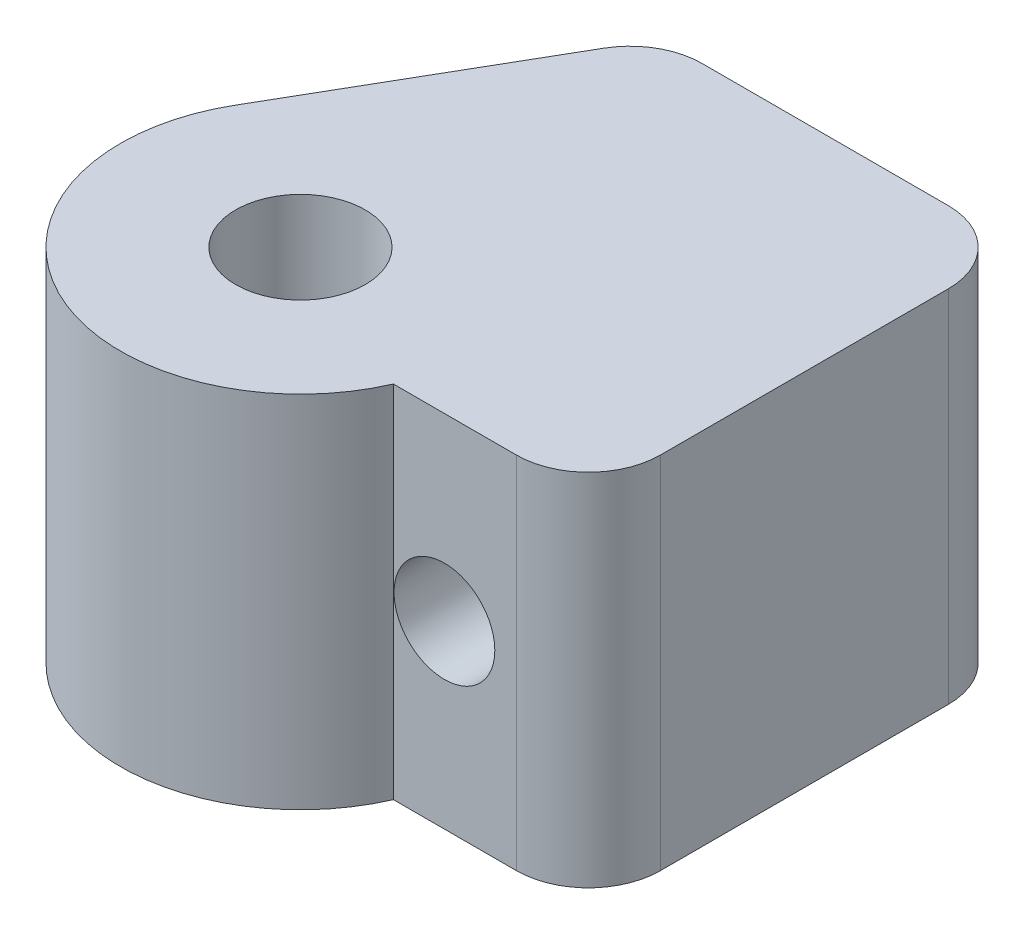
ISO-10303-21;
HEADER;
FILE_DESCRIPTION(('STEP AP214'),'2;1');
FILE_NAME('part.step','',(''),(''),'','','');
FILE_SCHEMA(('AUTOMOTIVE_DESIGN { 1 0 10303 214 1 1 1 1 }'));
ENDSEC;
DATA;
#1=APPLICATION_CONTEXT('core data for automotive mechanical design processes');
#2=APPLICATION_PROTOCOL_DEFINITION('international standard','automotive_design',2000,#1);
#3=PRODUCT_CONTEXT('',#1,'mechanical');
#4=PRODUCT('Part','Part','',(#3));
#5=PRODUCT_RELATED_PRODUCT_CATEGORY('part','',(#4));
#6=PRODUCT_DEFINITION_FORMATION('','',#4);
#7=PRODUCT_DEFINITION_CONTEXT('part definition',#1,'design');
#8=PRODUCT_DEFINITION('design','',#6,#7);
#9=PRODUCT_DEFINITION_SHAPE('','',#8);
#10=(LENGTH_UNIT() NAMED_UNIT(*) SI_UNIT(.MILLI.,.METRE.));
#11=(NAMED_UNIT(*) PLANE_ANGLE_UNIT() SI_UNIT($,.RADIAN.));
#12=(NAMED_UNIT(*) SI_UNIT($,.STERADIAN.) SOLID_ANGLE_UNIT());
#13=UNCERTAINTY_MEASURE_WITH_UNIT(LENGTH_MEASURE(1.E-05),#10,'distance_accuracy_value','');
#14=(GEOMETRIC_REPRESENTATION_CONTEXT(3) GLOBAL_UNCERTAINTY_ASSIGNED_CONTEXT((#13)) GLOBAL_UNIT_ASSIGNED_CONTEXT((#10,
#11,#12)) REPRESENTATION_CONTEXT('',''));
#15=CARTESIAN_POINT('',(0.,0.,0.));
#16=DIRECTION('',(0.,0.,1.));
#17=DIRECTION('',(1.,0.,0.));
#18=AXIS2_PLACEMENT_3D('',#15,#16,#17);
#19=CARTESIAN_POINT('',(0.,12.7,0.));
#20=DIRECTION('',(0.,1.,0.));
#21=DIRECTION('',(0.,0.,1.));
#22=AXIS2_PLACEMENT_3D('',#19,#20,#21);
#23=PLANE('',#22);
#24=DIRECTION('',(1.,0.,0.));
#25=VECTOR('',#24,1.);
#26=CARTESIAN_POINT('',(0.,12.7,-12.7));
#27=LINE('',#26,#25);
#28=CARTESIAN_POINT('',(1.46646968374165,12.7,-12.7));
#29=VERTEX_POINT('',#28);
#30=CARTESIAN_POINT('',(10.16,12.7,-12.7));
#31=VERTEX_POINT('',#30);
#32=EDGE_CURVE('E154',#29,#31,#27,.T.);
#33=ORIENTED_EDGE('',*,*,#32,.F.);
#34=CARTESIAN_POINT('',(1.46646968374165,12.7,-10.16));
#35=DIRECTION('',(0.,1.,0.));
#36=DIRECTION('',(0.,0.,1.));
#37=AXIS2_PLACEMENT_3D('',#34,#35,#36);
#38=CIRCLE('',#37,2.54);
#39=CARTESIAN_POINT('',(-0.733234841870825,12.7,-11.43));
#40=VERTEX_POINT('',#39);
#41=EDGE_CURVE('E152',#29,#40,#38,.T.);
#42=ORIENTED_EDGE('',*,*,#41,.T.);
#43=DIRECTION('',(0.5,0.,-0.866025403784439));
#44=VECTOR('',#43,1.);
#45=CARTESIAN_POINT('',(-5.49926131403118,12.7,-3.175));
#46=LINE('',#45,#44);
#47=CARTESIAN_POINT('',(-5.49926131403118,12.7,-3.175));
#48=VERTEX_POINT('',#47);
#49=EDGE_CURVE('E132',#48,#40,#46,.T.);
#50=ORIENTED_EDGE('',*,*,#49,.F.);
#51=CARTESIAN_POINT('',(0.,12.7,0.));
#52=DIRECTION('',(0.,1.,0.));
#53=DIRECTION('',(0.,0.,1.));
#54=AXIS2_PLACEMENT_3D('',#51,#52,#53);
#55=CIRCLE('',#54,6.35);
#56=CARTESIAN_POINT('',(5.81987113259392,12.7,2.54));
#57=VERTEX_POINT('',#56);
#58=EDGE_CURVE('E143',#48,#57,#55,.T.);
#59=ORIENTED_EDGE('',*,*,#58,.T.);
#60=DIRECTION('',(1.,0.,0.));
#61=VECTOR('',#60,1.);
#62=CARTESIAN_POINT('',(5.81987113259392,12.7,2.54));
#63=LINE('',#62,#61);
#64=CARTESIAN_POINT('',(10.16,12.7,2.54));
#65=VERTEX_POINT('',#64);
#66=EDGE_CURVE('E179',#57,#65,#63,.T.);
#67=ORIENTED_EDGE('',*,*,#66,.T.);
#68=CARTESIAN_POINT('',(10.16,12.7,0.));
#69=DIRECTION('',(0.,1.,0.));
#70=DIRECTION('',(0.,0.,1.));
#71=AXIS2_PLACEMENT_3D('',#68,#69,#70);
#72=CIRCLE('',#71,2.54);
#73=CARTESIAN_POINT('',(12.7,12.7,0.));
#74=VERTEX_POINT('',#73);
#75=EDGE_CURVE('E83',#65,#74,#72,.T.);
#76=ORIENTED_EDGE('',*,*,#75,.T.);
#77=DIRECTION('',(0.,0.,-1.));
#78=VECTOR('',#77,1.);
#79=CARTESIAN_POINT('',(12.7,12.7,2.54));
#80=LINE('',#79,#78);
#81=CARTESIAN_POINT('',(12.7,12.7,-10.16));
#82=VERTEX_POINT('',#81);
#83=EDGE_CURVE('E158',#74,#82,#80,.T.);
#84=ORIENTED_EDGE('',*,*,#83,.T.);
#85=CARTESIAN_POINT('',(10.16,12.7,-10.16));
#86=DIRECTION('',(0.,1.,0.));
#87=DIRECTION('',(0.,0.,1.));
#88=AXIS2_PLACEMENT_3D('',#85,#86,#87);
#89=CIRCLE('',#88,2.54);
#90=EDGE_CURVE('E202',#82,#31,#89,.T.);
#91=ORIENTED_EDGE('',*,*,#90,.T.);
#92=EDGE_LOOP('',(#33,#42,#50,#59,#67,#76,#84,#91));
#93=FACE_BOUND('',#92,.T.);
#94=CARTESIAN_POINT('',(0.,12.7,0.));
#95=DIRECTION('',(0.,1.,0.));
#96=DIRECTION('',(0.,0.,1.));
#97=AXIS2_PLACEMENT_3D('',#94,#95,#96);
#98=CIRCLE('',#97,2.286);
#99=CARTESIAN_POINT('',(0.,12.7,2.286));
#100=VERTEX_POINT('',#99);
#101=EDGE_CURVE('E167',#100,#100,#98,.T.);
#102=ORIENTED_EDGE('',*,*,#101,.F.);
#103=EDGE_LOOP('',(#102));
#104=FACE_BOUND('',#103,.T.);
#105=ADVANCED_FACE('F61',(#93,#104),#23,.T.);
#106=CARTESIAN_POINT('',(0.,0.,0.));
#107=DIRECTION('',(0.,1.,0.));
#108=DIRECTION('',(0.,0.,1.));
#109=AXIS2_PLACEMENT_3D('',#106,#107,#108);
#110=PLANE('',#109);
#111=DIRECTION('',(0.5,0.,-0.866025403784439));
#112=VECTOR('',#111,1.);
#113=CARTESIAN_POINT('',(-5.49926131403118,0.,-3.175));
#114=LINE('',#113,#112);
#115=CARTESIAN_POINT('',(-5.49926131403118,0.,-3.175));
#116=VERTEX_POINT('',#115);
#117=CARTESIAN_POINT('',(-0.733234841870825,0.,-11.43));
#118=VERTEX_POINT('',#117);
#119=EDGE_CURVE('E135',#116,#118,#114,.T.);
#120=ORIENTED_EDGE('',*,*,#119,.T.);
#121=CARTESIAN_POINT('',(1.46646968374165,0.,-10.16));
#122=DIRECTION('',(0.,1.,0.));
#123=DIRECTION('',(0.,0.,1.));
#124=AXIS2_PLACEMENT_3D('',#121,#122,#123);
#125=CIRCLE('',#124,2.54);
#126=CARTESIAN_POINT('',(1.46646968374165,0.,-12.7));
#127=VERTEX_POINT('',#126);
#128=EDGE_CURVE('E190',#118,#127,#125,.F.);
#129=ORIENTED_EDGE('',*,*,#128,.T.);
#130=DIRECTION('',(1.,0.,0.));
#131=VECTOR('',#130,1.);
#132=CARTESIAN_POINT('',(0.,0.,-12.7));
#133=LINE('',#132,#131);
#134=CARTESIAN_POINT('',(10.16,0.,-12.7));
#135=VERTEX_POINT('',#134);
#136=EDGE_CURVE('E170',#127,#135,#133,.T.);
#137=ORIENTED_EDGE('',*,*,#136,.T.);
#138=CARTESIAN_POINT('',(10.16,0.,-10.16));
#139=DIRECTION('',(0.,1.,0.));
#140=DIRECTION('',(0.,0.,1.));
#141=AXIS2_PLACEMENT_3D('',#138,#139,#140);
#142=CIRCLE('',#141,2.54);
#143=CARTESIAN_POINT('',(12.7,0.,-10.16));
#144=VERTEX_POINT('',#143);
#145=EDGE_CURVE('E187',#135,#144,#142,.F.);
#146=ORIENTED_EDGE('',*,*,#145,.T.);
#147=DIRECTION('',(0.,0.,-1.));
#148=VECTOR('',#147,1.);
#149=CARTESIAN_POINT('',(12.7,0.,2.54));
#150=LINE('',#149,#148);
#151=CARTESIAN_POINT('',(12.7,0.,0.));
#152=VERTEX_POINT('',#151);
#153=EDGE_CURVE('E166',#152,#144,#150,.T.);
#154=ORIENTED_EDGE('',*,*,#153,.F.);
#155=CARTESIAN_POINT('',(10.16,0.,0.));
#156=DIRECTION('',(0.,1.,0.));
#157=DIRECTION('',(0.,0.,1.));
#158=AXIS2_PLACEMENT_3D('',#155,#156,#157);
#159=CIRCLE('',#158,2.54);
#160=CARTESIAN_POINT('',(10.16,0.,2.54));
#161=VERTEX_POINT('',#160);
#162=EDGE_CURVE('E184',#152,#161,#159,.F.);
#163=ORIENTED_EDGE('',*,*,#162,.T.);
#164=DIRECTION('',(1.,0.,0.));
#165=VECTOR('',#164,1.);
#166=CARTESIAN_POINT('',(5.81987113259392,0.,2.54));
#167=LINE('',#166,#165);
#168=CARTESIAN_POINT('',(5.81987113259392,0.,2.54));
#169=VERTEX_POINT('',#168);
#170=EDGE_CURVE('E162',#169,#161,#167,.T.);
#171=ORIENTED_EDGE('',*,*,#170,.F.);
#172=CARTESIAN_POINT('',(0.,0.,0.));
#173=DIRECTION('',(0.,1.,0.));
#174=DIRECTION('',(0.,0.,1.));
#175=AXIS2_PLACEMENT_3D('',#172,#173,#174);
#176=CIRCLE('',#175,6.35);
#177=EDGE_CURVE('E176',#116,#169,#176,.T.);
#178=ORIENTED_EDGE('',*,*,#177,.F.);
#179=EDGE_LOOP('',(#120,#129,#137,#146,#154,#163,#171,#178));
#180=FACE_BOUND('',#179,.T.);
#181=CARTESIAN_POINT('',(0.,0.,0.));
#182=DIRECTION('',(0.,1.,0.));
#183=DIRECTION('',(0.,0.,1.));
#184=AXIS2_PLACEMENT_3D('',#181,#182,#183);
#185=CIRCLE('',#184,2.286);
#186=CARTESIAN_POINT('',(0.,0.,2.286));
#187=VERTEX_POINT('',#186);
#188=EDGE_CURVE('E236',#187,#187,#185,.T.);
#189=ORIENTED_EDGE('',*,*,#188,.T.);
#190=EDGE_LOOP('',(#189));
#191=FACE_BOUND('',#190,.T.);
#192=ADVANCED_FACE('F216',(#180,#191),#110,.F.);
#193=CARTESIAN_POINT('',(5.81987113259392,12.7,2.54));
#194=DIRECTION('',(0.,0.,-1.));
#195=DIRECTION('',(-1.,0.,0.));
#196=AXIS2_PLACEMENT_3D('',#193,#194,#195);
#197=PLANE('',#196);
#198=CARTESIAN_POINT('',(7.62,6.35,2.54));
#199=DIRECTION('',(0.,0.,1.));
#200=DIRECTION('',(1.,0.,0.));
#201=AXIS2_PLACEMENT_3D('',#198,#199,#200);
#202=CIRCLE('',#201,1.778);
#203=CARTESIAN_POINT('',(9.398,6.35,2.54));
#204=VERTEX_POINT('',#203);
#205=EDGE_CURVE('E244',#204,#204,#202,.T.);
#206=ORIENTED_EDGE('',*,*,#205,.F.);
#207=EDGE_LOOP('',(#206));
#208=FACE_BOUND('',#207,.T.);
#209=ORIENTED_EDGE('',*,*,#170,.T.);
#210=DIRECTION('',(0.,-1.,0.));
#211=VECTOR('',#210,1.);
#212=CARTESIAN_POINT('',(10.16,12.7,2.54));
#213=LINE('',#212,#211);
#214=EDGE_CURVE('E12',#161,#65,#213,.F.);
#215=ORIENTED_EDGE('',*,*,#214,.T.);
#216=ORIENTED_EDGE('',*,*,#66,.F.);
#217=DIRECTION('',(0.,-1.,0.));
#218=VECTOR('',#217,1.);
#219=CARTESIAN_POINT('',(5.81987113259392,12.7,2.54));
#220=LINE('',#219,#218);
#221=EDGE_CURVE('E140',#57,#169,#220,.T.);
#222=ORIENTED_EDGE('',*,*,#221,.T.);
#223=EDGE_LOOP('',(#209,#215,#216,#222));
#224=FACE_BOUND('',#223,.T.);
#225=ADVANCED_FACE('F230',(#208,#224),#197,.F.);
#226=CARTESIAN_POINT('',(12.7,12.7,2.54));
#227=DIRECTION('',(-1.,0.,0.));
#228=DIRECTION('',(0.,0.,1.));
#229=AXIS2_PLACEMENT_3D('',#226,#227,#228);
#230=PLANE('',#229);
#231=ORIENTED_EDGE('',*,*,#153,.T.);
#232=DIRECTION('',(0.,-1.,0.));
#233=VECTOR('',#232,1.);
#234=CARTESIAN_POINT('',(12.7,12.7,-10.16));
#235=LINE('',#234,#233);
#236=EDGE_CURVE('E70',#144,#82,#235,.F.);
#237=ORIENTED_EDGE('',*,*,#236,.T.);
#238=ORIENTED_EDGE('',*,*,#83,.F.);
#239=DIRECTION('',(0.,-1.,0.));
#240=VECTOR('',#239,1.);
#241=CARTESIAN_POINT('',(12.7,12.7,0.));
#242=LINE('',#241,#240);
#243=EDGE_CURVE('E207',#74,#152,#242,.T.);
#244=ORIENTED_EDGE('',*,*,#243,.T.);
#245=EDGE_LOOP('',(#231,#237,#238,#244));
#246=FACE_BOUND('',#245,.T.);
#247=ADVANCED_FACE('F213',(#246),#230,.F.);
#248=CARTESIAN_POINT('',(0.,12.7,-12.7));
#249=DIRECTION('',(0.,0.,-1.));
#250=DIRECTION('',(-1.,0.,0.));
#251=AXIS2_PLACEMENT_3D('',#248,#249,#250);
#252=PLANE('',#251);
#253=CARTESIAN_POINT('',(7.62,6.35,-12.7));
#254=DIRECTION('',(0.,0.,1.));
#255=DIRECTION('',(1.,0.,0.));
#256=AXIS2_PLACEMENT_3D('',#253,#254,#255);
#257=CIRCLE('',#256,1.778);
#258=CARTESIAN_POINT('',(9.398,6.35,-12.7));
#259=VERTEX_POINT('',#258);
#260=EDGE_CURVE('E240',#259,#259,#257,.T.);
#261=ORIENTED_EDGE('',*,*,#260,.T.);
#262=EDGE_LOOP('',(#261));
#263=FACE_BOUND('',#262,.T.);
#264=ORIENTED_EDGE('',*,*,#136,.F.);
#265=DIRECTION('',(0.,-1.,0.));
#266=VECTOR('',#265,1.);
#267=CARTESIAN_POINT('',(1.46646968374165,12.7,-12.7));
#268=LINE('',#267,#266);
#269=EDGE_CURVE('E197',#127,#29,#268,.F.);
#270=ORIENTED_EDGE('',*,*,#269,.T.);
#271=ORIENTED_EDGE('',*,*,#32,.T.);
#272=DIRECTION('',(0.,-1.,0.));
#273=VECTOR('',#272,1.);
#274=CARTESIAN_POINT('',(10.16,0.,-12.7));
#275=LINE('',#274,#273);
#276=EDGE_CURVE('E193',#31,#135,#275,.T.);
#277=ORIENTED_EDGE('',*,*,#276,.T.);
#278=EDGE_LOOP('',(#264,#270,#271,#277));
#279=FACE_BOUND('',#278,.T.);
#280=ADVANCED_FACE('F225',(#263,#279),#252,.T.);
#281=CARTESIAN_POINT('',(-5.49926131403118,12.7,-3.175));
#282=DIRECTION('',(-0.866025403784439,0.,-0.5));
#283=DIRECTION('',(-0.5,0.,0.866025403784439));
#284=AXIS2_PLACEMENT_3D('',#281,#282,#283);
#285=PLANE('',#284);
#286=ORIENTED_EDGE('',*,*,#49,.T.);
#287=DIRECTION('',(0.,-1.,0.));
#288=VECTOR('',#287,1.);
#289=CARTESIAN_POINT('',(-0.733234841870825,12.7,-11.43));
#290=LINE('',#289,#288);
#291=EDGE_CURVE('E139',#40,#118,#290,.T.);
#292=ORIENTED_EDGE('',*,*,#291,.T.);
#293=ORIENTED_EDGE('',*,*,#119,.F.);
#294=DIRECTION('',(0.,-1.,0.));
#295=VECTOR('',#294,1.);
#296=CARTESIAN_POINT('',(-5.49926131403118,12.7,-3.175));
#297=LINE('',#296,#295);
#298=EDGE_CURVE('E127',#48,#116,#297,.T.);
#299=ORIENTED_EDGE('',*,*,#298,.F.);
#300=EDGE_LOOP('',(#286,#292,#293,#299));
#301=FACE_BOUND('',#300,.T.);
#302=ADVANCED_FACE('F129',(#301),#285,.T.);
#303=CARTESIAN_POINT('',(0.,12.7,0.));
#304=DIRECTION('',(0.,-1.,0.));
#305=DIRECTION('',(0.,0.,-1.));
#306=AXIS2_PLACEMENT_3D('',#303,#304,#305);
#307=CYLINDRICAL_SURFACE('',#306,6.35);
#308=ORIENTED_EDGE('',*,*,#177,.T.);
#309=ORIENTED_EDGE('',*,*,#221,.F.);
#310=ORIENTED_EDGE('',*,*,#58,.F.);
#311=ORIENTED_EDGE('',*,*,#298,.T.);
#312=EDGE_LOOP('',(#308,#309,#310,#311));
#313=FACE_BOUND('',#312,.T.);
#314=ADVANCED_FACE('F144',(#313),#307,.T.);
#315=CARTESIAN_POINT('',(0.,12.7,0.));
#316=DIRECTION('',(0.,-1.,0.));
#317=DIRECTION('',(0.,0.,-1.));
#318=AXIS2_PLACEMENT_3D('',#315,#316,#317);
#319=CYLINDRICAL_SURFACE('',#318,2.286);
#320=ORIENTED_EDGE('',*,*,#101,.T.);
#321=EDGE_LOOP('',(#320));
#322=FACE_BOUND('',#321,.T.);
#323=ORIENTED_EDGE('',*,*,#188,.F.);
#324=EDGE_LOOP('',(#323));
#325=FACE_BOUND('',#324,.T.);
#326=ADVANCED_FACE('F256',(#322,#325),#319,.F.);
#327=CARTESIAN_POINT('',(7.62,6.35,-12.7));
#328=DIRECTION('',(0.,0.,1.));
#329=DIRECTION('',(1.,0.,0.));
#330=AXIS2_PLACEMENT_3D('',#327,#328,#329);
#331=CYLINDRICAL_SURFACE('',#330,1.778);
#332=ORIENTED_EDGE('',*,*,#260,.F.);
#333=EDGE_LOOP('',(#332));
#334=FACE_BOUND('',#333,.T.);
#335=ORIENTED_EDGE('',*,*,#205,.T.);
#336=EDGE_LOOP('',(#335));
#337=FACE_BOUND('',#336,.T.);
#338=ADVANCED_FACE('F253',(#334,#337),#331,.F.);
#339=CARTESIAN_POINT('',(1.46646968374165,12.7,-10.16));
#340=DIRECTION('',(0.,-1.,0.));
#341=DIRECTION('',(0.,0.,-1.));
#342=AXIS2_PLACEMENT_3D('',#339,#340,#341);
#343=CYLINDRICAL_SURFACE('',#342,2.54);
#344=ORIENTED_EDGE('',*,*,#41,.F.);
#345=ORIENTED_EDGE('',*,*,#269,.F.);
#346=ORIENTED_EDGE('',*,*,#128,.F.);
#347=ORIENTED_EDGE('',*,*,#291,.F.);
#348=EDGE_LOOP('',(#344,#345,#346,#347));
#349=FACE_BOUND('',#348,.T.);
#350=ADVANCED_FACE('F228',(#349),#343,.T.);
#351=CARTESIAN_POINT('',(10.16,12.7,-10.16));
#352=DIRECTION('',(0.,1.,0.));
#353=DIRECTION('',(0.,0.,1.));
#354=AXIS2_PLACEMENT_3D('',#351,#352,#353);
#355=CYLINDRICAL_SURFACE('',#354,2.54);
#356=ORIENTED_EDGE('',*,*,#90,.F.);
#357=ORIENTED_EDGE('',*,*,#236,.F.);
#358=ORIENTED_EDGE('',*,*,#145,.F.);
#359=ORIENTED_EDGE('',*,*,#276,.F.);
#360=EDGE_LOOP('',(#356,#357,#358,#359));
#361=FACE_BOUND('',#360,.T.);
#362=ADVANCED_FACE('F223',(#361),#355,.T.);
#363=CARTESIAN_POINT('',(10.16,12.7,0.));
#364=DIRECTION('',(0.,-1.,0.));
#365=DIRECTION('',(0.,0.,-1.));
#366=AXIS2_PLACEMENT_3D('',#363,#364,#365);
#367=CYLINDRICAL_SURFACE('',#366,2.54);
#368=ORIENTED_EDGE('',*,*,#75,.F.);
#369=ORIENTED_EDGE('',*,*,#214,.F.);
#370=ORIENTED_EDGE('',*,*,#162,.F.);
#371=ORIENTED_EDGE('',*,*,#243,.F.);
#372=EDGE_LOOP('',(#368,#369,#370,#371));
#373=FACE_BOUND('',#372,.T.);
#374=ADVANCED_FACE('F63',(#373),#367,.T.);
#375=CLOSED_SHELL('',(#105,#192,#225,#247,#280,#302,#314,#326,#338,#350,#362,#374));
#376=MANIFOLD_SOLID_BREP('B2',#375);
#377=ADVANCED_BREP_SHAPE_REPRESENTATION('',(#18,#376),#14);
#378=SHAPE_DEFINITION_REPRESENTATION(#9,#377);
ENDSEC;
END-ISO-10303-21;
